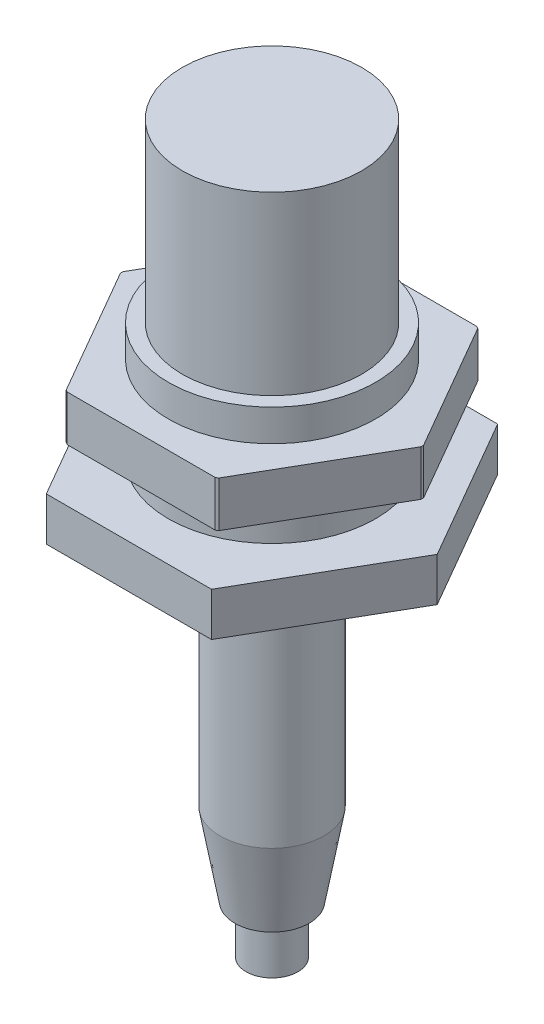
ISO-10303-21;
HEADER;
FILE_DESCRIPTION(('STEP AP214'),'2;1');
FILE_NAME('part.step','',(''),(''),'','','');
FILE_SCHEMA(('AUTOMOTIVE_DESIGN { 1 0 10303 214 1 1 1 1 }'));
ENDSEC;
DATA;
#1=APPLICATION_CONTEXT('core data for automotive mechanical design processes');
#2=APPLICATION_PROTOCOL_DEFINITION('international standard','automotive_design',2000,#1);
#3=PRODUCT_CONTEXT('',#1,'mechanical');
#4=PRODUCT('Part','Part','',(#3));
#5=PRODUCT_RELATED_PRODUCT_CATEGORY('part','',(#4));
#6=PRODUCT_DEFINITION_FORMATION('','',#4);
#7=PRODUCT_DEFINITION_CONTEXT('part definition',#1,'design');
#8=PRODUCT_DEFINITION('design','',#6,#7);
#9=PRODUCT_DEFINITION_SHAPE('','',#8);
#10=(LENGTH_UNIT() NAMED_UNIT(*) SI_UNIT(.MILLI.,.METRE.));
#11=(NAMED_UNIT(*) PLANE_ANGLE_UNIT() SI_UNIT($,.RADIAN.));
#12=(NAMED_UNIT(*) SI_UNIT($,.STERADIAN.) SOLID_ANGLE_UNIT());
#13=UNCERTAINTY_MEASURE_WITH_UNIT(LENGTH_MEASURE(1.E-05),#10,'distance_accuracy_value','');
#14=(GEOMETRIC_REPRESENTATION_CONTEXT(3) GLOBAL_UNCERTAINTY_ASSIGNED_CONTEXT((#13)) GLOBAL_UNIT_ASSIGNED_CONTEXT((#10,
#11,#12)) REPRESENTATION_CONTEXT('',''));
#15=CARTESIAN_POINT('',(0.,0.,0.));
#16=DIRECTION('',(0.,0.,1.));
#17=DIRECTION('',(1.,0.,0.));
#18=AXIS2_PLACEMENT_3D('',#15,#16,#17);
#19=CARTESIAN_POINT('',(0.,42.2586353040899,0.));
#20=DIRECTION('',(0.,1.,0.));
#21=DIRECTION('',(-1.,0.,0.));
#22=AXIS2_PLACEMENT_3D('',#19,#20,#21);
#23=CYLINDRICAL_SURFACE('',#22,6.35);
#24=DIRECTION('',(0.,-1.,0.));
#25=VECTOR('',#24,1.);
#26=CARTESIAN_POINT('',(-3.34103277445761,9.24925921861058,-5.4));
#27=LINE('',#26,#25);
#28=CARTESIAN_POINT('',(-3.34103277445761,2.5,-5.4));
#29=VERTEX_POINT('',#28);
#30=CARTESIAN_POINT('',(-3.34103277445762,0.,-5.4));
#31=VERTEX_POINT('',#30);
#32=EDGE_CURVE('E183',#29,#31,#27,.T.);
#33=ORIENTED_EDGE('',*,*,#32,.T.);
#34=CARTESIAN_POINT('',(0.,0.,0.));
#35=DIRECTION('',(0.,1.,0.));
#36=DIRECTION('',(-1.,0.,0.));
#37=AXIS2_PLACEMENT_3D('',#34,#35,#36);
#38=CIRCLE('',#37,6.35);
#39=CARTESIAN_POINT('',(3.34103277445762,0.,-5.4));
#40=VERTEX_POINT('',#39);
#41=EDGE_CURVE('E189',#31,#40,#38,.T.);
#42=ORIENTED_EDGE('',*,*,#41,.T.);
#43=DIRECTION('',(0.,-1.,0.));
#44=VECTOR('',#43,1.);
#45=CARTESIAN_POINT('',(3.34103277445762,9.24925921861058,-5.4));
#46=LINE('',#45,#44);
#47=CARTESIAN_POINT('',(3.34103277445762,2.5,-5.4));
#48=VERTEX_POINT('',#47);
#49=EDGE_CURVE('E175',#48,#40,#46,.T.);
#50=ORIENTED_EDGE('',*,*,#49,.F.);
#51=CARTESIAN_POINT('',(0.,2.5,0.));
#52=DIRECTION('',(0.,1.,0.));
#53=DIRECTION('',(-1.,0.,0.));
#54=AXIS2_PLACEMENT_3D('',#51,#52,#53);
#55=CIRCLE('',#54,6.35);
#56=EDGE_CURVE('E191',#29,#48,#55,.T.);
#57=ORIENTED_EDGE('',*,*,#56,.F.);
#58=EDGE_LOOP('',(#33,#42,#50,#57));
#59=FACE_BOUND('',#58,.T.);
#60=ADVANCED_FACE('F40',(#59),#23,.T.);
#61=CARTESIAN_POINT('',(9.2075,5.294,0.));
#62=DIRECTION('',(0.,-1.,0.));
#63=DIRECTION('',(1.,0.,0.));
#64=AXIS2_PLACEMENT_3D('',#61,#62,#63);
#65=PLANE('',#64);
#66=CARTESIAN_POINT('',(0.,5.294,0.));
#67=DIRECTION('',(0.,1.,0.));
#68=DIRECTION('',(-1.,0.,0.));
#69=AXIS2_PLACEMENT_3D('',#66,#67,#68);
#70=CIRCLE('',#69,6.35);
#71=CARTESIAN_POINT('',(-6.34999999999999,5.294,0.));
#72=VERTEX_POINT('',#71);
#73=EDGE_CURVE('E210',#72,#72,#70,.T.);
#74=ORIENTED_EDGE('',*,*,#73,.F.);
#75=EDGE_LOOP('',(#74));
#76=FACE_BOUND('',#75,.T.);
#77=DIRECTION('',(0.5,0.,-0.866025403784439));
#78=VECTOR('',#77,1.);
#79=CARTESIAN_POINT('',(4.6267118522049,5.294,8.0137));
#80=LINE('',#79,#78);
#81=CARTESIAN_POINT('',(4.67298437887098,5.294,7.93355363281978));
#82=VERTEX_POINT('',#81);
#83=CARTESIAN_POINT('',(9.20715117774374,5.294,0.0801463671802182));
#84=VERTEX_POINT('',#83);
#85=EDGE_CURVE('E723',#82,#84,#80,.T.);
#86=ORIENTED_EDGE('',*,*,#85,.T.);
#87=CARTESIAN_POINT('',(0.,5.294,0.));
#88=DIRECTION('',(0.,1.,0.));
#89=DIRECTION('',(-1.,0.,0.));
#90=AXIS2_PLACEMENT_3D('',#87,#88,#89);
#91=CIRCLE('',#90,9.2075);
#92=CARTESIAN_POINT('',(9.20715117774374,5.294,-0.0801463671802217));
#93=VERTEX_POINT('',#92);
#94=EDGE_CURVE('E729',#84,#93,#91,.T.);
#95=ORIENTED_EDGE('',*,*,#94,.T.);
#96=DIRECTION('',(-0.5,0.,-0.866025403784439));
#97=VECTOR('',#96,1.);
#98=CARTESIAN_POINT('',(9.25342370440981,5.294,0.));
#99=LINE('',#98,#97);
#100=CARTESIAN_POINT('',(4.67298437887097,5.294,-7.93355363281978));
#101=VERTEX_POINT('',#100);
#102=EDGE_CURVE('E733',#93,#101,#99,.T.);
#103=ORIENTED_EDGE('',*,*,#102,.T.);
#104=CARTESIAN_POINT('',(4.53416679887276,5.294,-8.0137));
#105=VERTEX_POINT('',#104);
#106=EDGE_CURVE('E266',#101,#105,#91,.T.);
#107=ORIENTED_EDGE('',*,*,#106,.T.);
#108=DIRECTION('',(-1.,0.,0.));
#109=VECTOR('',#108,1.);
#110=CARTESIAN_POINT('',(4.6267118522049,5.294,-8.0137));
#111=LINE('',#110,#109);
#112=CARTESIAN_POINT('',(-4.53416679887275,5.294,-8.0137));
#113=VERTEX_POINT('',#112);
#114=EDGE_CURVE('E738',#105,#113,#111,.T.);
#115=ORIENTED_EDGE('',*,*,#114,.T.);
#116=CARTESIAN_POINT('',(-4.67298437887098,5.294,-7.93355363281977));
#117=VERTEX_POINT('',#116);
#118=EDGE_CURVE('E208',#113,#117,#91,.T.);
#119=ORIENTED_EDGE('',*,*,#118,.T.);
#120=DIRECTION('',(-0.5,0.,0.866025403784438));
#121=VECTOR('',#120,1.);
#122=CARTESIAN_POINT('',(-4.6267118522049,5.294,-8.0137));
#123=LINE('',#122,#121);
#124=CARTESIAN_POINT('',(-9.20715117774373,5.294,-0.0801463671802408));
#125=VERTEX_POINT('',#124);
#126=EDGE_CURVE('E737',#117,#125,#123,.T.);
#127=ORIENTED_EDGE('',*,*,#126,.T.);
#128=CARTESIAN_POINT('',(-9.20715117774373,5.294,0.080146367180242));
#129=VERTEX_POINT('',#128);
#130=EDGE_CURVE('E205',#125,#129,#91,.T.);
#131=ORIENTED_EDGE('',*,*,#130,.T.);
#132=DIRECTION('',(0.5,0.,0.866025403784438));
#133=VECTOR('',#132,1.);
#134=CARTESIAN_POINT('',(-9.25342370440981,5.294,0.));
#135=LINE('',#134,#133);
#136=CARTESIAN_POINT('',(-4.67298437887098,5.294,7.93355363281977));
#137=VERTEX_POINT('',#136);
#138=EDGE_CURVE('E740',#129,#137,#135,.T.);
#139=ORIENTED_EDGE('',*,*,#138,.T.);
#140=CARTESIAN_POINT('',(-4.53416679887275,5.294,8.0137));
#141=VERTEX_POINT('',#140);
#142=EDGE_CURVE('E209',#137,#141,#91,.T.);
#143=ORIENTED_EDGE('',*,*,#142,.T.);
#144=DIRECTION('',(1.,0.,0.));
#145=VECTOR('',#144,1.);
#146=CARTESIAN_POINT('',(-4.6267118522049,5.294,8.0137));
#147=LINE('',#146,#145);
#148=CARTESIAN_POINT('',(4.53416679887276,5.294,8.0137));
#149=VERTEX_POINT('',#148);
#150=EDGE_CURVE('E734',#141,#149,#147,.T.);
#151=ORIENTED_EDGE('',*,*,#150,.T.);
#152=EDGE_CURVE('E732',#149,#82,#91,.T.);
#153=ORIENTED_EDGE('',*,*,#152,.T.);
#154=EDGE_LOOP('',(#86,#95,#103,#107,#115,#119,#127,#131,#139,#143,#151,#153));
#155=FACE_BOUND('',#154,.T.);
#156=ADVANCED_FACE('F384',(#76,#155),#65,.F.);
#157=CARTESIAN_POINT('',(0.,42.2586353040899,0.));
#158=DIRECTION('',(0.,1.,0.));
#159=DIRECTION('',(-1.,0.,0.));
#160=AXIS2_PLACEMENT_3D('',#157,#158,#159);
#161=CYLINDRICAL_SURFACE('',#160,9.2075);
#162=DIRECTION('',(0.,1.,0.));
#163=VECTOR('',#162,1.);
#164=CARTESIAN_POINT('',(9.20715117774374,42.2586353040899,0.0801463671802147));
#165=LINE('',#164,#163);
#166=CARTESIAN_POINT('',(9.20715117774374,2.5,0.0801463671802147));
#167=VERTEX_POINT('',#166);
#168=EDGE_CURVE('E302',#167,#84,#165,.T.);
#169=ORIENTED_EDGE('',*,*,#168,.F.);
#170=CARTESIAN_POINT('',(0.,2.5,0.));
#171=DIRECTION('',(0.,1.,0.));
#172=DIRECTION('',(-1.,0.,0.));
#173=AXIS2_PLACEMENT_3D('',#170,#171,#172);
#174=CIRCLE('',#173,9.2075);
#175=CARTESIAN_POINT('',(9.20715117774374,2.5,-0.0801463671802217));
#176=VERTEX_POINT('',#175);
#177=EDGE_CURVE('E273',#167,#176,#174,.T.);
#178=ORIENTED_EDGE('',*,*,#177,.T.);
#179=DIRECTION('',(0.,1.,0.));
#180=VECTOR('',#179,1.);
#181=CARTESIAN_POINT('',(9.20715117774374,42.2586353040899,-0.0801463671802217));
#182=LINE('',#181,#180);
#183=EDGE_CURVE('E254',#93,#176,#182,.F.);
#184=ORIENTED_EDGE('',*,*,#183,.F.);
#185=ORIENTED_EDGE('',*,*,#94,.F.);
#186=EDGE_LOOP('',(#169,#178,#184,#185));
#187=FACE_BOUND('',#186,.T.);
#188=ADVANCED_FACE('F389',(#187),#161,.T.);
#189=DIRECTION('',(0.,1.,0.));
#190=VECTOR('',#189,1.);
#191=CARTESIAN_POINT('',(4.67298437887098,42.2586353040899,7.93355363281978));
#192=LINE('',#191,#190);
#193=CARTESIAN_POINT('',(4.67298437887097,2.5,7.93355363281978));
#194=VERTEX_POINT('',#193);
#195=EDGE_CURVE('E267',#82,#194,#192,.F.);
#196=ORIENTED_EDGE('',*,*,#195,.F.);
#197=ORIENTED_EDGE('',*,*,#152,.F.);
#198=DIRECTION('',(0.,1.,0.));
#199=VECTOR('',#198,1.);
#200=CARTESIAN_POINT('',(4.53416679887277,42.2586353040899,8.01369999999999));
#201=LINE('',#200,#199);
#202=CARTESIAN_POINT('',(4.53416679887276,2.5,8.0137));
#203=VERTEX_POINT('',#202);
#204=EDGE_CURVE('E748',#203,#149,#201,.T.);
#205=ORIENTED_EDGE('',*,*,#204,.F.);
#206=EDGE_CURVE('E274',#203,#194,#174,.T.);
#207=ORIENTED_EDGE('',*,*,#206,.T.);
#208=EDGE_LOOP('',(#196,#197,#205,#207));
#209=FACE_BOUND('',#208,.T.);
#210=ADVANCED_FACE('F399',(#209),#161,.T.);
#211=DIRECTION('',(0.,1.,0.));
#212=VECTOR('',#211,1.);
#213=CARTESIAN_POINT('',(4.67298437887098,42.2586353040899,-7.93355363281978));
#214=LINE('',#213,#212);
#215=CARTESIAN_POINT('',(4.67298437887097,2.5,-7.93355363281978));
#216=VERTEX_POINT('',#215);
#217=EDGE_CURVE('E251',#216,#101,#214,.T.);
#218=ORIENTED_EDGE('',*,*,#217,.F.);
#219=CARTESIAN_POINT('',(4.53416679887275,2.5,-8.0137));
#220=VERTEX_POINT('',#219);
#221=EDGE_CURVE('E264',#216,#220,#174,.T.);
#222=ORIENTED_EDGE('',*,*,#221,.T.);
#223=DIRECTION('',(0.,1.,0.));
#224=VECTOR('',#223,1.);
#225=CARTESIAN_POINT('',(4.53416679887277,42.2586353040899,-8.0137));
#226=LINE('',#225,#224);
#227=EDGE_CURVE('E292',#105,#220,#226,.F.);
#228=ORIENTED_EDGE('',*,*,#227,.F.);
#229=ORIENTED_EDGE('',*,*,#106,.F.);
#230=EDGE_LOOP('',(#218,#222,#228,#229));
#231=FACE_BOUND('',#230,.T.);
#232=ADVANCED_FACE('F262',(#231),#161,.T.);
#233=DIRECTION('',(0.,1.,0.));
#234=VECTOR('',#233,1.);
#235=CARTESIAN_POINT('',(-4.53416679887274,42.2586353040899,-8.0137));
#236=LINE('',#235,#234);
#237=CARTESIAN_POINT('',(-4.53416679887274,2.5,-8.0137));
#238=VERTEX_POINT('',#237);
#239=EDGE_CURVE('E281',#238,#113,#236,.T.);
#240=ORIENTED_EDGE('',*,*,#239,.F.);
#241=CARTESIAN_POINT('',(-4.67298437887098,2.5,-7.93355363281976));
#242=VERTEX_POINT('',#241);
#243=EDGE_CURVE('E203',#238,#242,#174,.T.);
#244=ORIENTED_EDGE('',*,*,#243,.T.);
#245=DIRECTION('',(0.,1.,0.));
#246=VECTOR('',#245,1.);
#247=CARTESIAN_POINT('',(-4.67298437887097,42.2586353040899,-7.93355363281977));
#248=LINE('',#247,#246);
#249=EDGE_CURVE('E62',#117,#242,#248,.F.);
#250=ORIENTED_EDGE('',*,*,#249,.F.);
#251=ORIENTED_EDGE('',*,*,#118,.F.);
#252=EDGE_LOOP('',(#240,#244,#250,#251));
#253=FACE_BOUND('',#252,.T.);
#254=ADVANCED_FACE('F278',(#253),#161,.T.);
#255=DIRECTION('',(0.,1.,0.));
#256=VECTOR('',#255,1.);
#257=CARTESIAN_POINT('',(-9.20715117774372,42.2586353040899,-0.0801463671802408));
#258=LINE('',#257,#256);
#259=CARTESIAN_POINT('',(-9.20715117774373,2.5,-0.0801463671802425));
#260=VERTEX_POINT('',#259);
#261=EDGE_CURVE('E286',#260,#125,#258,.T.);
#262=ORIENTED_EDGE('',*,*,#261,.F.);
#263=CARTESIAN_POINT('',(-9.20715117774373,2.5,0.0801463671802512));
#264=VERTEX_POINT('',#263);
#265=EDGE_CURVE('E194',#260,#264,#174,.T.);
#266=ORIENTED_EDGE('',*,*,#265,.T.);
#267=DIRECTION('',(0.,1.,0.));
#268=VECTOR('',#267,1.);
#269=CARTESIAN_POINT('',(-9.20715117774372,42.2586353040899,0.0801463671802416));
#270=LINE('',#269,#268);
#271=EDGE_CURVE('E750',#129,#264,#270,.F.);
#272=ORIENTED_EDGE('',*,*,#271,.F.);
#273=ORIENTED_EDGE('',*,*,#130,.F.);
#274=EDGE_LOOP('',(#262,#266,#272,#273));
#275=FACE_BOUND('',#274,.T.);
#276=ADVANCED_FACE('F290',(#275),#161,.T.);
#277=DIRECTION('',(0.,1.,0.));
#278=VECTOR('',#277,1.);
#279=CARTESIAN_POINT('',(-4.67298437887097,42.2586353040899,7.93355363281977));
#280=LINE('',#279,#278);
#281=CARTESIAN_POINT('',(-4.67298437887098,2.5,7.93355363281976));
#282=VERTEX_POINT('',#281);
#283=EDGE_CURVE('E295',#282,#137,#280,.T.);
#284=ORIENTED_EDGE('',*,*,#283,.F.);
#285=CARTESIAN_POINT('',(-4.53416679887274,2.5,8.0137));
#286=VERTEX_POINT('',#285);
#287=EDGE_CURVE('E204',#282,#286,#174,.T.);
#288=ORIENTED_EDGE('',*,*,#287,.T.);
#289=DIRECTION('',(0.,1.,0.));
#290=VECTOR('',#289,1.);
#291=CARTESIAN_POINT('',(-4.53416679887274,42.2586353040899,8.01369999999999));
#292=LINE('',#291,#290);
#293=EDGE_CURVE('E746',#141,#286,#292,.F.);
#294=ORIENTED_EDGE('',*,*,#293,.F.);
#295=ORIENTED_EDGE('',*,*,#142,.F.);
#296=EDGE_LOOP('',(#284,#288,#294,#295));
#297=FACE_BOUND('',#296,.T.);
#298=ADVANCED_FACE('F397',(#297),#161,.T.);
#299=CARTESIAN_POINT('',(6.35,2.5,0.));
#300=DIRECTION('',(0.,1.,0.));
#301=DIRECTION('',(-1.,0.,0.));
#302=AXIS2_PLACEMENT_3D('',#299,#300,#301);
#303=PLANE('',#302);
#304=ORIENTED_EDGE('',*,*,#56,.T.);
#305=DIRECTION('',(1.,0.,0.));
#306=VECTOR('',#305,1.);
#307=CARTESIAN_POINT('',(-3.34103277445762,2.5,-5.4));
#308=LINE('',#307,#306);
#309=EDGE_CURVE('E54',#29,#48,#308,.T.);
#310=ORIENTED_EDGE('',*,*,#309,.F.);
#311=EDGE_LOOP('',(#304,#310));
#312=FACE_BOUND('',#311,.T.);
#313=DIRECTION('',(0.5,0.,-0.866025403784439));
#314=VECTOR('',#313,1.);
#315=CARTESIAN_POINT('',(8.52756777830736,2.5,1.2572193429844));
#316=LINE('',#315,#314);
#317=EDGE_CURVE('E12',#194,#167,#316,.T.);
#318=ORIENTED_EDGE('',*,*,#317,.F.);
#319=ORIENTED_EDGE('',*,*,#206,.F.);
#320=DIRECTION('',(1.,0.,0.));
#321=VECTOR('',#320,1.);
#322=CARTESIAN_POINT('',(6.35,2.5,8.0137));
#323=LINE('',#322,#321);
#324=EDGE_CURVE('E240',#286,#203,#323,.T.);
#325=ORIENTED_EDGE('',*,*,#324,.F.);
#326=ORIENTED_EDGE('',*,*,#287,.F.);
#327=DIRECTION('',(0.5,0.,0.866025403784439));
#328=VECTOR('',#327,1.);
#329=CARTESIAN_POINT('',(-5.35256777830735,2.5,6.7564806570156));
#330=LINE('',#329,#328);
#331=EDGE_CURVE('E242',#264,#282,#330,.T.);
#332=ORIENTED_EDGE('',*,*,#331,.F.);
#333=ORIENTED_EDGE('',*,*,#265,.F.);
#334=DIRECTION('',(-0.5,0.,0.866025403784439));
#335=VECTOR('',#334,1.);
#336=CARTESIAN_POINT('',(-5.35256777830735,2.5,-6.7564806570156));
#337=LINE('',#336,#335);
#338=EDGE_CURVE('E244',#242,#260,#337,.T.);
#339=ORIENTED_EDGE('',*,*,#338,.F.);
#340=ORIENTED_EDGE('',*,*,#243,.F.);
#341=DIRECTION('',(-1.,0.,0.));
#342=VECTOR('',#341,1.);
#343=CARTESIAN_POINT('',(6.35,2.5,-8.0137));
#344=LINE('',#343,#342);
#345=EDGE_CURVE('E246',#220,#238,#344,.T.);
#346=ORIENTED_EDGE('',*,*,#345,.F.);
#347=ORIENTED_EDGE('',*,*,#221,.F.);
#348=DIRECTION('',(-0.5,0.,-0.866025403784439));
#349=VECTOR('',#348,1.);
#350=CARTESIAN_POINT('',(8.52756777830736,2.5,-1.25721934298441));
#351=LINE('',#350,#349);
#352=EDGE_CURVE('E48',#176,#216,#351,.T.);
#353=ORIENTED_EDGE('',*,*,#352,.F.);
#354=ORIENTED_EDGE('',*,*,#177,.F.);
#355=EDGE_LOOP('',(#318,#319,#325,#326,#332,#333,#339,#340,#346,#347,#353,#354));
#356=FACE_BOUND('',#355,.T.);
#357=ADVANCED_FACE('F271',(#312,#356),#303,.F.);
#358=CARTESIAN_POINT('',(10.1219,0.,0.));
#359=DIRECTION('',(0.,-1.,0.));
#360=DIRECTION('',(1.,0.,0.));
#361=AXIS2_PLACEMENT_3D('',#358,#359,#360);
#362=PLANE('',#361);
#363=ORIENTED_EDGE('',*,*,#41,.F.);
#364=DIRECTION('',(1.,0.,0.));
#365=VECTOR('',#364,1.);
#366=CARTESIAN_POINT('',(-3.34103277445762,0.,-5.4));
#367=LINE('',#366,#365);
#368=EDGE_CURVE('E178',#31,#40,#367,.T.);
#369=ORIENTED_EDGE('',*,*,#368,.T.);
#370=EDGE_LOOP('',(#363,#369));
#371=FACE_BOUND('',#370,.T.);
#372=DIRECTION('',(-0.5,0.,0.866025403784439));
#373=VECTOR('',#372,1.);
#374=CARTESIAN_POINT('',(-5.06095,0.,-8.76582253456571));
#375=LINE('',#374,#373);
#376=CARTESIAN_POINT('',(-5.06095,0.,-8.76582253456571));
#377=VERTEX_POINT('',#376);
#378=CARTESIAN_POINT('',(-10.1219,0.,0.));
#379=VERTEX_POINT('',#378);
#380=EDGE_CURVE('E319',#377,#379,#375,.T.);
#381=ORIENTED_EDGE('',*,*,#380,.T.);
#382=DIRECTION('',(0.5,0.,0.866025403784439));
#383=VECTOR('',#382,1.);
#384=CARTESIAN_POINT('',(-10.1219,0.,0.));
#385=LINE('',#384,#383);
#386=CARTESIAN_POINT('',(-5.06094999999999,0.,8.76582253456571));
#387=VERTEX_POINT('',#386);
#388=EDGE_CURVE('E316',#379,#387,#385,.T.);
#389=ORIENTED_EDGE('',*,*,#388,.T.);
#390=DIRECTION('',(1.,0.,0.));
#391=VECTOR('',#390,1.);
#392=CARTESIAN_POINT('',(-5.06095,0.,8.76582253456571));
#393=LINE('',#392,#391);
#394=CARTESIAN_POINT('',(5.06095,0.,8.76582253456571));
#395=VERTEX_POINT('',#394);
#396=EDGE_CURVE('E313',#387,#395,#393,.T.);
#397=ORIENTED_EDGE('',*,*,#396,.T.);
#398=DIRECTION('',(0.5,0.,-0.866025403784439));
#399=VECTOR('',#398,1.);
#400=CARTESIAN_POINT('',(5.06095,0.,8.76582253456571));
#401=LINE('',#400,#399);
#402=CARTESIAN_POINT('',(10.1219,0.,0.));
#403=VERTEX_POINT('',#402);
#404=EDGE_CURVE('E310',#395,#403,#401,.T.);
#405=ORIENTED_EDGE('',*,*,#404,.T.);
#406=DIRECTION('',(-0.5,0.,-0.866025403784439));
#407=VECTOR('',#406,1.);
#408=CARTESIAN_POINT('',(10.1219,0.,0.));
#409=LINE('',#408,#407);
#410=CARTESIAN_POINT('',(5.06095,0.,-8.76582253456571));
#411=VERTEX_POINT('',#410);
#412=EDGE_CURVE('E307',#403,#411,#409,.T.);
#413=ORIENTED_EDGE('',*,*,#412,.T.);
#414=DIRECTION('',(-1.,0.,0.));
#415=VECTOR('',#414,1.);
#416=CARTESIAN_POINT('',(5.06095,0.,-8.76582253456571));
#417=LINE('',#416,#415);
#418=EDGE_CURVE('E197',#411,#377,#417,.T.);
#419=ORIENTED_EDGE('',*,*,#418,.T.);
#420=EDGE_LOOP('',(#381,#389,#397,#405,#413,#419));
#421=FACE_BOUND('',#420,.T.);
#422=ADVANCED_FACE('F187',(#371,#421),#362,.F.);
#423=CARTESIAN_POINT('',(5.49275,18.034,0.));
#424=DIRECTION('',(0.,-1.,0.));
#425=DIRECTION('',(1.,0.,0.));
#426=AXIS2_PLACEMENT_3D('',#423,#424,#425);
#427=PLANE('',#426);
#428=CARTESIAN_POINT('',(0.,18.034,0.));
#429=DIRECTION('',(0.,1.,0.));
#430=DIRECTION('',(-1.,0.,0.));
#431=AXIS2_PLACEMENT_3D('',#428,#429,#430);
#432=CIRCLE('',#431,5.49275);
#433=CARTESIAN_POINT('',(-5.49274999999999,18.034,0.));
#434=VERTEX_POINT('',#433);
#435=EDGE_CURVE('E219',#434,#434,#432,.T.);
#436=ORIENTED_EDGE('',*,*,#435,.T.);
#437=EDGE_LOOP('',(#436));
#438=FACE_BOUND('',#437,.T.);
#439=ADVANCED_FACE('F413',(#438),#427,.F.);
#440=CARTESIAN_POINT('',(0.,42.2586353040899,0.));
#441=DIRECTION('',(0.,1.,0.));
#442=DIRECTION('',(-1.,0.,0.));
#443=AXIS2_PLACEMENT_3D('',#440,#441,#442);
#444=CYLINDRICAL_SURFACE('',#443,5.49275);
#445=ORIENTED_EDGE('',*,*,#435,.F.);
#446=EDGE_LOOP('',(#445));
#447=FACE_BOUND('',#446,.T.);
#448=CARTESIAN_POINT('',(0.,7.239,0.));
#449=DIRECTION('',(0.,1.,0.));
#450=DIRECTION('',(-1.,0.,0.));
#451=AXIS2_PLACEMENT_3D('',#448,#449,#450);
#452=CIRCLE('',#451,5.49275);
#453=CARTESIAN_POINT('',(-5.49274999999999,7.239,0.));
#454=VERTEX_POINT('',#453);
#455=EDGE_CURVE('E216',#454,#454,#452,.T.);
#456=ORIENTED_EDGE('',*,*,#455,.T.);
#457=EDGE_LOOP('',(#456));
#458=FACE_BOUND('',#457,.T.);
#459=ADVANCED_FACE('F409',(#447,#458),#444,.T.);
#460=CARTESIAN_POINT('',(5.49275,7.239,0.));
#461=DIRECTION('',(0.,-1.,0.));
#462=DIRECTION('',(1.,0.,0.));
#463=AXIS2_PLACEMENT_3D('',#460,#461,#462);
#464=PLANE('',#463);
#465=ORIENTED_EDGE('',*,*,#455,.F.);
#466=EDGE_LOOP('',(#465));
#467=FACE_BOUND('',#466,.T.);
#468=CARTESIAN_POINT('',(0.,7.239,0.));
#469=DIRECTION('',(0.,1.,0.));
#470=DIRECTION('',(-1.,0.,0.));
#471=AXIS2_PLACEMENT_3D('',#468,#469,#470);
#472=CIRCLE('',#471,6.35);
#473=CARTESIAN_POINT('',(-6.34999999999999,7.239,0.));
#474=VERTEX_POINT('',#473);
#475=EDGE_CURVE('E213',#474,#474,#472,.T.);
#476=ORIENTED_EDGE('',*,*,#475,.T.);
#477=EDGE_LOOP('',(#476));
#478=FACE_BOUND('',#477,.T.);
#479=ADVANCED_FACE('F405',(#467,#478),#464,.F.);
#480=CARTESIAN_POINT('',(0.,42.2586353040899,0.));
#481=DIRECTION('',(0.,1.,0.));
#482=DIRECTION('',(-1.,0.,0.));
#483=AXIS2_PLACEMENT_3D('',#480,#481,#482);
#484=CYLINDRICAL_SURFACE('',#483,6.35);
#485=ORIENTED_EDGE('',*,*,#475,.F.);
#486=EDGE_LOOP('',(#485));
#487=FACE_BOUND('',#486,.T.);
#488=ORIENTED_EDGE('',*,*,#73,.T.);
#489=EDGE_LOOP('',(#488));
#490=FACE_BOUND('',#489,.T.);
#491=ADVANCED_FACE('F402',(#487,#490),#484,.T.);
#492=CARTESIAN_POINT('',(-5.06094999999999,28.9153470791082,-8.76582253456571));
#493=DIRECTION('',(-0.866025403784439,0.,-0.5));
#494=DIRECTION('',(-0.5,0.,0.866025403784439));
#495=AXIS2_PLACEMENT_3D('',#492,#493,#494);
#496=PLANE('',#495);
#497=DIRECTION('',(0.,-1.,0.));
#498=VECTOR('',#497,1.);
#499=CARTESIAN_POINT('',(-5.06094999999999,28.9153470791082,-8.76582253456571));
#500=LINE('',#499,#498);
#501=CARTESIAN_POINT('',(-5.06095,-2.667,-8.76582253456571));
#502=VERTEX_POINT('',#501);
#503=EDGE_CURVE('E346',#377,#502,#500,.T.);
#504=ORIENTED_EDGE('',*,*,#503,.T.);
#505=DIRECTION('',(0.5,0.,-0.866025403784439));
#506=VECTOR('',#505,1.);
#507=CARTESIAN_POINT('',(-5.06095,-2.667,-8.76582253456571));
#508=LINE('',#507,#506);
#509=CARTESIAN_POINT('',(-10.1219,-2.667,0.));
#510=VERTEX_POINT('',#509);
#511=EDGE_CURVE('E322',#510,#502,#508,.T.);
#512=ORIENTED_EDGE('',*,*,#511,.F.);
#513=DIRECTION('',(0.,-1.,0.));
#514=VECTOR('',#513,1.);
#515=CARTESIAN_POINT('',(-10.1219,28.9153470791082,0.));
#516=LINE('',#515,#514);
#517=EDGE_CURVE('E337',#379,#510,#516,.T.);
#518=ORIENTED_EDGE('',*,*,#517,.F.);
#519=ORIENTED_EDGE('',*,*,#380,.F.);
#520=EDGE_LOOP('',(#504,#512,#518,#519));
#521=FACE_BOUND('',#520,.T.);
#522=ADVANCED_FACE('F353',(#521),#496,.T.);
#523=CARTESIAN_POINT('',(5.06095,28.9153470791081,-8.76582253456571));
#524=DIRECTION('',(0.,0.,-1.));
#525=DIRECTION('',(-1.,0.,0.));
#526=AXIS2_PLACEMENT_3D('',#523,#524,#525);
#527=PLANE('',#526);
#528=DIRECTION('',(0.,-1.,0.));
#529=VECTOR('',#528,1.);
#530=CARTESIAN_POINT('',(5.06095,28.9153470791081,-8.76582253456571));
#531=LINE('',#530,#529);
#532=CARTESIAN_POINT('',(5.06095,-2.667,-8.76582253456571));
#533=VERTEX_POINT('',#532);
#534=EDGE_CURVE('E344',#411,#533,#531,.T.);
#535=ORIENTED_EDGE('',*,*,#534,.T.);
#536=DIRECTION('',(1.,0.,0.));
#537=VECTOR('',#536,1.);
#538=CARTESIAN_POINT('',(5.06095,-2.667,-8.76582253456571));
#539=LINE('',#538,#537);
#540=EDGE_CURVE('E325',#502,#533,#539,.T.);
#541=ORIENTED_EDGE('',*,*,#540,.F.);
#542=ORIENTED_EDGE('',*,*,#503,.F.);
#543=ORIENTED_EDGE('',*,*,#418,.F.);
#544=EDGE_LOOP('',(#535,#541,#542,#543));
#545=FACE_BOUND('',#544,.T.);
#546=ADVANCED_FACE('F356',(#545),#527,.T.);
#547=CARTESIAN_POINT('',(10.1219,28.9153470791081,0.));
#548=DIRECTION('',(0.866025403784439,0.,-0.5));
#549=DIRECTION('',(-0.5,0.,-0.866025403784439));
#550=AXIS2_PLACEMENT_3D('',#547,#548,#549);
#551=PLANE('',#550);
#552=DIRECTION('',(0.,-1.,0.));
#553=VECTOR('',#552,1.);
#554=CARTESIAN_POINT('',(10.1219,28.9153470791081,0.));
#555=LINE('',#554,#553);
#556=CARTESIAN_POINT('',(10.1219,-2.667,0.));
#557=VERTEX_POINT('',#556);
#558=EDGE_CURVE('E342',#403,#557,#555,.T.);
#559=ORIENTED_EDGE('',*,*,#558,.T.);
#560=DIRECTION('',(0.5,0.,0.866025403784439));
#561=VECTOR('',#560,1.);
#562=CARTESIAN_POINT('',(10.1219,-2.667,0.));
#563=LINE('',#562,#561);
#564=EDGE_CURVE('E328',#533,#557,#563,.T.);
#565=ORIENTED_EDGE('',*,*,#564,.F.);
#566=ORIENTED_EDGE('',*,*,#534,.F.);
#567=ORIENTED_EDGE('',*,*,#412,.F.);
#568=EDGE_LOOP('',(#559,#565,#566,#567));
#569=FACE_BOUND('',#568,.T.);
#570=ADVANCED_FACE('F374',(#569),#551,.T.);
#571=CARTESIAN_POINT('',(5.06095,28.9153470791081,8.76582253456571));
#572=DIRECTION('',(0.866025403784439,0.,0.5));
#573=DIRECTION('',(0.5,0.,-0.866025403784439));
#574=AXIS2_PLACEMENT_3D('',#571,#572,#573);
#575=PLANE('',#574);
#576=DIRECTION('',(0.,-1.,0.));
#577=VECTOR('',#576,1.);
#578=CARTESIAN_POINT('',(5.06095,28.9153470791081,8.76582253456571));
#579=LINE('',#578,#577);
#580=CARTESIAN_POINT('',(5.06095,-2.667,8.76582253456571));
#581=VERTEX_POINT('',#580);
#582=EDGE_CURVE('E340',#395,#581,#579,.T.);
#583=ORIENTED_EDGE('',*,*,#582,.T.);
#584=DIRECTION('',(-0.5,0.,0.866025403784439));
#585=VECTOR('',#584,1.);
#586=CARTESIAN_POINT('',(5.06095,-2.667,8.76582253456571));
#587=LINE('',#586,#585);
#588=EDGE_CURVE('E331',#557,#581,#587,.T.);
#589=ORIENTED_EDGE('',*,*,#588,.F.);
#590=ORIENTED_EDGE('',*,*,#558,.F.);
#591=ORIENTED_EDGE('',*,*,#404,.F.);
#592=EDGE_LOOP('',(#583,#589,#590,#591));
#593=FACE_BOUND('',#592,.T.);
#594=ADVANCED_FACE('F371',(#593),#575,.T.);
#595=CARTESIAN_POINT('',(-5.06094999999999,28.9153470791082,8.76582253456571));
#596=DIRECTION('',(0.,0.,1.));
#597=DIRECTION('',(1.,0.,0.));
#598=AXIS2_PLACEMENT_3D('',#595,#596,#597);
#599=PLANE('',#598);
#600=DIRECTION('',(0.,-1.,0.));
#601=VECTOR('',#600,1.);
#602=CARTESIAN_POINT('',(-5.06094999999999,28.9153470791082,8.76582253456571));
#603=LINE('',#602,#601);
#604=CARTESIAN_POINT('',(-5.06095,-2.667,8.76582253456571));
#605=VERTEX_POINT('',#604);
#606=EDGE_CURVE('E338',#387,#605,#603,.T.);
#607=ORIENTED_EDGE('',*,*,#606,.T.);
#608=DIRECTION('',(-1.,0.,0.));
#609=VECTOR('',#608,1.);
#610=CARTESIAN_POINT('',(-5.06095,-2.667,8.76582253456571));
#611=LINE('',#610,#609);
#612=EDGE_CURVE('E334',#581,#605,#611,.T.);
#613=ORIENTED_EDGE('',*,*,#612,.F.);
#614=ORIENTED_EDGE('',*,*,#582,.F.);
#615=ORIENTED_EDGE('',*,*,#396,.F.);
#616=EDGE_LOOP('',(#607,#613,#614,#615));
#617=FACE_BOUND('',#616,.T.);
#618=ADVANCED_FACE('F368',(#617),#599,.T.);
#619=CARTESIAN_POINT('',(-10.1219,28.9153470791082,0.));
#620=DIRECTION('',(-0.866025403784439,0.,0.5));
#621=DIRECTION('',(0.5,0.,0.866025403784439));
#622=AXIS2_PLACEMENT_3D('',#619,#620,#621);
#623=PLANE('',#622);
#624=ORIENTED_EDGE('',*,*,#517,.T.);
#625=DIRECTION('',(-0.5,0.,-0.866025403784439));
#626=VECTOR('',#625,1.);
#627=CARTESIAN_POINT('',(-10.1219,-2.667,0.));
#628=LINE('',#627,#626);
#629=EDGE_CURVE('E304',#605,#510,#628,.T.);
#630=ORIENTED_EDGE('',*,*,#629,.F.);
#631=ORIENTED_EDGE('',*,*,#606,.F.);
#632=ORIENTED_EDGE('',*,*,#388,.F.);
#633=EDGE_LOOP('',(#624,#630,#631,#632));
#634=FACE_BOUND('',#633,.T.);
#635=ADVANCED_FACE('F363',(#634),#623,.T.);
#636=CARTESIAN_POINT('',(0.,-26.416,0.));
#637=DIRECTION('',(0.,1.,0.));
#638=DIRECTION('',(-1.,0.,0.));
#639=AXIS2_PLACEMENT_3D('',#636,#637,#638);
#640=PLANE('',#639);
#641=CARTESIAN_POINT('',(0.,-26.416,0.));
#642=DIRECTION('',(0.,1.,0.));
#643=DIRECTION('',(-1.,0.,0.));
#644=AXIS2_PLACEMENT_3D('',#641,#642,#643);
#645=CIRCLE('',#644,1.58750000000001);
#646=CARTESIAN_POINT('',(-1.5875,-26.416,0.));
#647=VERTEX_POINT('',#646);
#648=EDGE_CURVE('E222',#647,#647,#645,.T.);
#649=ORIENTED_EDGE('',*,*,#648,.F.);
#650=EDGE_LOOP('',(#649));
#651=FACE_BOUND('',#650,.T.);
#652=ADVANCED_FACE('F418',(#651),#640,.F.);
#653=CARTESIAN_POINT('',(0.,42.2586353040899,0.));
#654=DIRECTION('',(0.,1.,0.));
#655=DIRECTION('',(-1.,0.,0.));
#656=AXIS2_PLACEMENT_3D('',#653,#654,#655);
#657=CYLINDRICAL_SURFACE('',#656,1.58750000000001);
#658=CARTESIAN_POINT('',(0.,-23.495,0.));
#659=DIRECTION('',(0.,1.,0.));
#660=DIRECTION('',(-1.,0.,0.));
#661=AXIS2_PLACEMENT_3D('',#658,#659,#660);
#662=CIRCLE('',#661,1.58750000000001);
#663=CARTESIAN_POINT('',(-1.5875,-23.495,0.));
#664=VERTEX_POINT('',#663);
#665=EDGE_CURVE('E225',#664,#664,#662,.T.);
#666=ORIENTED_EDGE('',*,*,#665,.F.);
#667=EDGE_LOOP('',(#666));
#668=FACE_BOUND('',#667,.T.);
#669=ORIENTED_EDGE('',*,*,#648,.T.);
#670=EDGE_LOOP('',(#669));
#671=FACE_BOUND('',#670,.T.);
#672=ADVANCED_FACE('F421',(#668,#671),#657,.T.);
#673=CARTESIAN_POINT('',(3.17500000000001,-23.495,0.));
#674=DIRECTION('',(0.,1.,0.));
#675=DIRECTION('',(-1.,0.,0.));
#676=AXIS2_PLACEMENT_3D('',#673,#674,#675);
#677=PLANE('',#676);
#678=CARTESIAN_POINT('',(0.,-23.495,0.));
#679=DIRECTION('',(0.,1.,0.));
#680=DIRECTION('',(-1.,0.,0.));
#681=AXIS2_PLACEMENT_3D('',#678,#679,#680);
#682=CIRCLE('',#681,2.279258938001);
#683=CARTESIAN_POINT('',(-2.279258938001,-23.495,0.));
#684=VERTEX_POINT('',#683);
#685=EDGE_CURVE('E237',#684,#684,#682,.F.);
#686=ORIENTED_EDGE('',*,*,#685,.T.);
#687=EDGE_LOOP('',(#686));
#688=FACE_BOUND('',#687,.T.);
#689=ORIENTED_EDGE('',*,*,#665,.T.);
#690=EDGE_LOOP('',(#689));
#691=FACE_BOUND('',#690,.T.);
#692=ADVANCED_FACE('F425',(#688,#691),#677,.F.);
#693=CARTESIAN_POINT('',(0.,42.2586353040899,0.));
#694=DIRECTION('',(0.,1.,0.));
#695=DIRECTION('',(-1.,0.,0.));
#696=AXIS2_PLACEMENT_3D('',#693,#694,#695);
#697=CYLINDRICAL_SURFACE('',#696,3.175);
#698=CARTESIAN_POINT('',(0.,-18.4149999999999,0.));
#699=DIRECTION('',(0.,1.,0.));
#700=DIRECTION('',(-1.,0.,0.));
#701=AXIS2_PLACEMENT_3D('',#698,#699,#700);
#702=CIRCLE('',#701,3.175);
#703=CARTESIAN_POINT('',(-3.175,-18.4149999999999,0.));
#704=VERTEX_POINT('',#703);
#705=EDGE_CURVE('E234',#704,#704,#702,.T.);
#706=ORIENTED_EDGE('',*,*,#705,.T.);
#707=EDGE_LOOP('',(#706));
#708=FACE_BOUND('',#707,.T.);
#709=CARTESIAN_POINT('',(0.,-4.445,0.));
#710=DIRECTION('',(0.,1.,0.));
#711=DIRECTION('',(-1.,0.,0.));
#712=AXIS2_PLACEMENT_3D('',#709,#710,#711);
#713=CIRCLE('',#712,3.175);
#714=CARTESIAN_POINT('',(-3.17499999999999,-4.445,0.));
#715=VERTEX_POINT('',#714);
#716=EDGE_CURVE('E228',#715,#715,#713,.T.);
#717=ORIENTED_EDGE('',*,*,#716,.F.);
#718=EDGE_LOOP('',(#717));
#719=FACE_BOUND('',#718,.T.);
#720=ADVANCED_FACE('F429',(#708,#719),#697,.T.);
#721=CARTESIAN_POINT('',(5.2705,-4.445,0.));
#722=DIRECTION('',(0.,1.,0.));
#723=DIRECTION('',(-1.,0.,0.));
#724=AXIS2_PLACEMENT_3D('',#721,#722,#723);
#725=PLANE('',#724);
#726=CARTESIAN_POINT('',(0.,-4.445,0.));
#727=DIRECTION('',(0.,1.,0.));
#728=DIRECTION('',(-1.,0.,0.));
#729=AXIS2_PLACEMENT_3D('',#726,#727,#728);
#730=CIRCLE('',#729,5.2705);
#731=CARTESIAN_POINT('',(-5.27049999999999,-4.445,0.));
#732=VERTEX_POINT('',#731);
#733=EDGE_CURVE('E231',#732,#732,#730,.T.);
#734=ORIENTED_EDGE('',*,*,#733,.F.);
#735=EDGE_LOOP('',(#734));
#736=FACE_BOUND('',#735,.T.);
#737=ORIENTED_EDGE('',*,*,#716,.T.);
#738=EDGE_LOOP('',(#737));
#739=FACE_BOUND('',#738,.T.);
#740=ADVANCED_FACE('F433',(#736,#739),#725,.F.);
#741=CARTESIAN_POINT('',(0.,42.2586353040899,0.));
#742=DIRECTION('',(0.,1.,0.));
#743=DIRECTION('',(-1.,0.,0.));
#744=AXIS2_PLACEMENT_3D('',#741,#742,#743);
#745=CYLINDRICAL_SURFACE('',#744,5.2705);
#746=CARTESIAN_POINT('',(0.,-2.667,0.));
#747=DIRECTION('',(0.,1.,0.));
#748=DIRECTION('',(-1.,0.,0.));
#749=AXIS2_PLACEMENT_3D('',#746,#747,#748);
#750=CIRCLE('',#749,5.2705);
#751=CARTESIAN_POINT('',(-5.27049999999999,-2.667,0.));
#752=VERTEX_POINT('',#751);
#753=EDGE_CURVE('E192',#752,#752,#750,.T.);
#754=ORIENTED_EDGE('',*,*,#753,.F.);
#755=EDGE_LOOP('',(#754));
#756=FACE_BOUND('',#755,.T.);
#757=ORIENTED_EDGE('',*,*,#733,.T.);
#758=EDGE_LOOP('',(#757));
#759=FACE_BOUND('',#758,.T.);
#760=ADVANCED_FACE('F436',(#756,#759),#745,.T.);
#761=CARTESIAN_POINT('',(5.27050000000001,-2.667,0.));
#762=DIRECTION('',(0.,1.,0.));
#763=DIRECTION('',(-1.,0.,0.));
#764=AXIS2_PLACEMENT_3D('',#761,#762,#763);
#765=PLANE('',#764);
#766=ORIENTED_EDGE('',*,*,#753,.T.);
#767=EDGE_LOOP('',(#766));
#768=FACE_BOUND('',#767,.T.);
#769=ORIENTED_EDGE('',*,*,#511,.T.);
#770=ORIENTED_EDGE('',*,*,#540,.T.);
#771=ORIENTED_EDGE('',*,*,#564,.T.);
#772=ORIENTED_EDGE('',*,*,#588,.T.);
#773=ORIENTED_EDGE('',*,*,#612,.T.);
#774=ORIENTED_EDGE('',*,*,#629,.T.);
#775=EDGE_LOOP('',(#769,#770,#771,#772,#773,#774));
#776=FACE_BOUND('',#775,.T.);
#777=ADVANCED_FACE('F360',(#768,#776),#765,.F.);
#778=CARTESIAN_POINT('',(0.,-18.4149999999999,0.));
#779=DIRECTION('',(0.,1.,0.));
#780=DIRECTION('',(-1.,0.,0.));
#781=AXIS2_PLACEMENT_3D('',#778,#779,#780);
#782=CONICAL_SURFACE('',#781,3.175,0.17453292519943);
#783=ORIENTED_EDGE('',*,*,#685,.F.);
#784=EDGE_LOOP('',(#783));
#785=FACE_BOUND('',#784,.T.);
#786=ORIENTED_EDGE('',*,*,#705,.F.);
#787=EDGE_LOOP('',(#786));
#788=FACE_BOUND('',#787,.T.);
#789=ADVANCED_FACE('F42',(#785,#788),#782,.T.);
#790=CARTESIAN_POINT('',(-4.62671185220491,-25.1401343895999,8.0137));
#791=DIRECTION('',(0.,0.,1.));
#792=DIRECTION('',(1.,0.,0.));
#793=AXIS2_PLACEMENT_3D('',#790,#791,#792);
#794=PLANE('',#793);
#795=ORIENTED_EDGE('',*,*,#204,.T.);
#796=ORIENTED_EDGE('',*,*,#150,.F.);
#797=ORIENTED_EDGE('',*,*,#293,.T.);
#798=ORIENTED_EDGE('',*,*,#324,.T.);
#799=EDGE_LOOP('',(#795,#796,#797,#798));
#800=FACE_BOUND('',#799,.T.);
#801=ADVANCED_FACE('F453',(#800),#794,.T.);
#802=CARTESIAN_POINT('',(-9.25342370440981,-25.1401343895999,0.));
#803=DIRECTION('',(-0.866025403784438,0.,0.5));
#804=DIRECTION('',(0.5,0.,0.866025403784439));
#805=AXIS2_PLACEMENT_3D('',#802,#803,#804);
#806=PLANE('',#805);
#807=ORIENTED_EDGE('',*,*,#283,.T.);
#808=ORIENTED_EDGE('',*,*,#138,.F.);
#809=ORIENTED_EDGE('',*,*,#271,.T.);
#810=ORIENTED_EDGE('',*,*,#331,.T.);
#811=EDGE_LOOP('',(#807,#808,#809,#810));
#812=FACE_BOUND('',#811,.T.);
#813=ADVANCED_FACE('F579',(#812),#806,.T.);
#814=CARTESIAN_POINT('',(-4.62671185220491,-25.1401343895999,-8.0137));
#815=DIRECTION('',(-0.866025403784438,0.,-0.5));
#816=DIRECTION('',(-0.5,0.,0.866025403784439));
#817=AXIS2_PLACEMENT_3D('',#814,#815,#816);
#818=PLANE('',#817);
#819=ORIENTED_EDGE('',*,*,#261,.T.);
#820=ORIENTED_EDGE('',*,*,#126,.F.);
#821=ORIENTED_EDGE('',*,*,#249,.T.);
#822=ORIENTED_EDGE('',*,*,#338,.T.);
#823=EDGE_LOOP('',(#819,#820,#821,#822));
#824=FACE_BOUND('',#823,.T.);
#825=ADVANCED_FACE('F285',(#824),#818,.T.);
#826=CARTESIAN_POINT('',(4.6267118522049,-25.1401343895999,-8.0137));
#827=DIRECTION('',(0.,0.,-1.));
#828=DIRECTION('',(-1.,0.,0.));
#829=AXIS2_PLACEMENT_3D('',#826,#827,#828);
#830=PLANE('',#829);
#831=ORIENTED_EDGE('',*,*,#239,.T.);
#832=ORIENTED_EDGE('',*,*,#114,.F.);
#833=ORIENTED_EDGE('',*,*,#227,.T.);
#834=ORIENTED_EDGE('',*,*,#345,.T.);
#835=EDGE_LOOP('',(#831,#832,#833,#834));
#836=FACE_BOUND('',#835,.T.);
#837=ADVANCED_FACE('F598',(#836),#830,.T.);
#838=CARTESIAN_POINT('',(9.2534237044098,-25.1401343895999,0.));
#839=DIRECTION('',(0.866025403784438,0.,-0.5));
#840=DIRECTION('',(-0.5,0.,-0.866025403784439));
#841=AXIS2_PLACEMENT_3D('',#838,#839,#840);
#842=PLANE('',#841);
#843=ORIENTED_EDGE('',*,*,#217,.T.);
#844=ORIENTED_EDGE('',*,*,#102,.F.);
#845=ORIENTED_EDGE('',*,*,#183,.T.);
#846=ORIENTED_EDGE('',*,*,#352,.T.);
#847=EDGE_LOOP('',(#843,#844,#845,#846));
#848=FACE_BOUND('',#847,.T.);
#849=ADVANCED_FACE('F250',(#848),#842,.T.);
#850=CARTESIAN_POINT('',(4.6267118522049,-25.1401343895999,8.0137));
#851=DIRECTION('',(0.866025403784439,0.,0.5));
#852=DIRECTION('',(0.5,0.,-0.866025403784439));
#853=AXIS2_PLACEMENT_3D('',#850,#851,#852);
#854=PLANE('',#853);
#855=ORIENTED_EDGE('',*,*,#168,.T.);
#856=ORIENTED_EDGE('',*,*,#85,.F.);
#857=ORIENTED_EDGE('',*,*,#195,.T.);
#858=ORIENTED_EDGE('',*,*,#317,.T.);
#859=EDGE_LOOP('',(#855,#856,#857,#858));
#860=FACE_BOUND('',#859,.T.);
#861=ADVANCED_FACE('F616',(#860),#854,.T.);
#862=CARTESIAN_POINT('',(-3.34103277445761,9.24925921861058,-5.4));
#863=DIRECTION('',(0.,0.,-1.));
#864=DIRECTION('',(-1.,0.,0.));
#865=AXIS2_PLACEMENT_3D('',#862,#863,#864);
#866=PLANE('',#865);
#867=ORIENTED_EDGE('',*,*,#309,.T.);
#868=ORIENTED_EDGE('',*,*,#49,.T.);
#869=ORIENTED_EDGE('',*,*,#368,.F.);
#870=ORIENTED_EDGE('',*,*,#32,.F.);
#871=EDGE_LOOP('',(#867,#868,#869,#870));
#872=FACE_BOUND('',#871,.T.);
#873=ADVANCED_FACE('F177',(#872),#866,.T.);
#874=CLOSED_SHELL('',(#60,#156,#188,#210,#232,#254,#276,#298,#357,#422,#439,#459,#479,#491,#522,
#546,#570,#594,#618,#635,#652,#672,#692,#720,#740,#760,#777,#789,#801,#813,#825,#837,#849,#861,#873));
#875=MANIFOLD_SOLID_BREP('B2',#874);
#876=ADVANCED_BREP_SHAPE_REPRESENTATION('',(#18,#875),#14);
#877=SHAPE_DEFINITION_REPRESENTATION(#9,#876);
ENDSEC;
END-ISO-10303-21;
